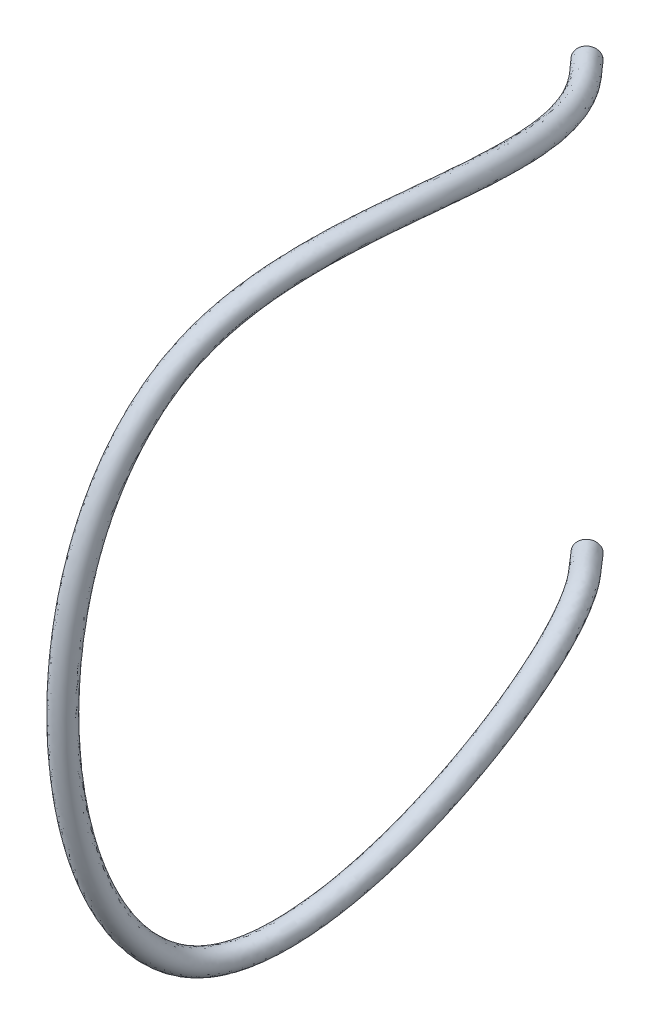
ISO-10303-21;
HEADER;
FILE_DESCRIPTION(('STEP AP214'),'2;1');
FILE_NAME('part.step','',(''),(''),'','','');
FILE_SCHEMA(('AUTOMOTIVE_DESIGN { 1 0 10303 214 1 1 1 1 }'));
ENDSEC;
DATA;
#1=APPLICATION_CONTEXT('core data for automotive mechanical design processes');
#2=APPLICATION_PROTOCOL_DEFINITION('international standard','automotive_design',2000,#1);
#3=PRODUCT_CONTEXT('',#1,'mechanical');
#4=PRODUCT('Part','Part','',(#3));
#5=PRODUCT_RELATED_PRODUCT_CATEGORY('part','',(#4));
#6=PRODUCT_DEFINITION_FORMATION('','',#4);
#7=PRODUCT_DEFINITION_CONTEXT('part definition',#1,'design');
#8=PRODUCT_DEFINITION('design','',#6,#7);
#9=PRODUCT_DEFINITION_SHAPE('','',#8);
#10=(LENGTH_UNIT() NAMED_UNIT(*) SI_UNIT(.MILLI.,.METRE.));
#11=(NAMED_UNIT(*) PLANE_ANGLE_UNIT() SI_UNIT($,.RADIAN.));
#12=(NAMED_UNIT(*) SI_UNIT($,.STERADIAN.) SOLID_ANGLE_UNIT());
#13=UNCERTAINTY_MEASURE_WITH_UNIT(LENGTH_MEASURE(1.E-05),#10,'distance_accuracy_value','');
#14=(GEOMETRIC_REPRESENTATION_CONTEXT(3) GLOBAL_UNCERTAINTY_ASSIGNED_CONTEXT((#13)) GLOBAL_UNIT_ASSIGNED_CONTEXT((#10,
#11,#12)) REPRESENTATION_CONTEXT('',''));
#15=CARTESIAN_POINT('',(0.,0.,0.));
#16=DIRECTION('',(0.,0.,1.));
#17=DIRECTION('',(1.,0.,0.));
#18=AXIS2_PLACEMENT_3D('',#15,#16,#17);
#19=CARTESIAN_POINT('',(45.5446581393842,91.0000000000004,-442.767858735174));
#20=DIRECTION('',(-0.655668098061901,0.,-0.755049233615855));
#21=DIRECTION('',(0.72822312542092,0.264188565464168,-0.632372897490219));
#22=AXIS2_PLACEMENT_3D('',#19,#20,#21);
#23=PLANE('',#22);
#24=CARTESIAN_POINT('',(45.5446581393842,91.0000000000004,-442.767858735174));
#25=DIRECTION('',(-0.655668098061901,0.,-0.755049233615855));
#26=DIRECTION('',(0.72822312542092,0.264188565464168,-0.632372897490219));
#27=AXIS2_PLACEMENT_3D('',#24,#25,#26);
#28=CIRCLE('',#27,3.99999999999983);
#29=CARTESIAN_POINT('',(48.4575506410677,92.056754261857,-445.297350325135));
#30=VERTEX_POINT('',#29);
#31=EDGE_CURVE('E44',#30,#30,#28,.T.);
#32=ORIENTED_EDGE('',*,*,#31,.T.);
#33=EDGE_LOOP('',(#32));
#34=FACE_BOUND('',#33,.T.);
#35=ADVANCED_FACE('F39',(#34),#23,.T.);
#36=CARTESIAN_POINT('',(45.5446581393831,-58.87,-442.767858735171));
#37=DIRECTION('',(0.655668098061896,0.,0.755049233615859));
#38=DIRECTION('',(0.755049233615859,0.,-0.655668098061896));
#39=AXIS2_PLACEMENT_3D('',#36,#37,#38);
#40=PLANE('',#39);
#41=CARTESIAN_POINT('',(45.5446581393831,-58.87,-442.767858735171));
#42=DIRECTION('',(0.655668098061896,0.,0.755049233615859));
#43=DIRECTION('',(0.755049233615859,0.,-0.655668098061896));
#44=AXIS2_PLACEMENT_3D('',#41,#42,#43);
#45=CIRCLE('',#44,3.99999999999983);
#46=CARTESIAN_POINT('',(48.5648550738464,-58.87,-445.390531127419));
#47=VERTEX_POINT('',#46);
#48=EDGE_CURVE('E10',#47,#47,#45,.T.);
#49=ORIENTED_EDGE('',*,*,#48,.F.);
#50=EDGE_LOOP('',(#49));
#51=FACE_BOUND('',#50,.T.);
#52=ADVANCED_FACE('F53',(#51),#40,.F.);
#53=CARTESIAN_POINT('',(48.4575506410677,92.056754261857,-445.297350325135));
#54=CARTESIAN_POINT('',(50.3875493327796,92.0567542611582,-443.074817256508));
#55=CARTESIAN_POINT('',(52.4843535071136,92.0146336075937,-440.883344708977));
#56=CARTESIAN_POINT('',(57.9286337386757,92.1335135214458,-433.984053774146));
#57=CARTESIAN_POINT('',(60.662065529613,92.4727452045095,-429.036904485743));
#58=CARTESIAN_POINT('',(64.8985399404625,93.4045020660071,-418.369218366216));
#59=CARTESIAN_POINT('',(66.4049769028892,93.9969651462761,-412.646351439814));
#60=CARTESIAN_POINT('',(69.4517712479349,95.7723134801796,-394.700857003907));
#61=CARTESIAN_POINT('',(69.5276188319668,96.9540892498482,-381.694649616329));
#62=CARTESIAN_POINT('',(67.4144691850316,97.365813609571,-355.530513215763));
#63=CARTESIAN_POINT('',(65.2181201506465,96.5982895178462,-342.371328793182));
#64=CARTESIAN_POINT('',(61.3527204895253,92.50618649552,-324.024565506061));
#65=CARTESIAN_POINT('',(59.9687246039237,90.6514054242433,-318.141502931796));
#66=CARTESIAN_POINT('',(57.1997749553748,85.7098328337427,-307.104612657496));
#67=CARTESIAN_POINT('',(55.8150378454201,82.6219738641295,-301.951126048831));
#68=CARTESIAN_POINT('',(52.6803536972611,73.319862536981,-290.638720980957));
#69=CARTESIAN_POINT('',(51.0375141143404,66.3456782031197,-285.027922923195));
#70=CARTESIAN_POINT('',(48.1616411575508,50.3167407571227,-275.774280105718));
#71=CARTESIAN_POINT('',(46.928004239872,41.2602080332135,-272.129272057686));
#72=CARTESIAN_POINT('',(43.8413708456977,12.254079473416,-263.934723714028));
#73=CARTESIAN_POINT('',(42.6012634473343,-9.53478137193692,-262.120917021619));
#74=CARTESIAN_POINT('',(42.0075900802884,-40.799833999419,-264.198095965556));
#75=CARTESIAN_POINT('',(42.021110921588,-50.9850829594817,-265.691348265239));
#76=CARTESIAN_POINT('',(42.4814607023931,-70.0355729871257,-270.18178477587));
#77=CARTESIAN_POINT('',(42.9281065501904,-78.9009725328332,-273.178271927403));
#78=CARTESIAN_POINT('',(44.2699670520108,-94.4676460201386,-280.596853703416));
#79=CARTESIAN_POINT('',(45.1649296611702,-101.172101911241,-285.018460752781));
#80=CARTESIAN_POINT('',(46.8650328614308,-108.949434208697,-292.696152146643));
#81=CARTESIAN_POINT('',(47.4915808572378,-111.161297197728,-295.430410871676));
#82=CARTESIAN_POINT('',(48.8674187241125,-114.697635770913,-301.240635637757));
#83=CARTESIAN_POINT('',(49.616870661272,-116.021353443503,-304.317113270531));
#84=CARTESIAN_POINT('',(51.6869009099639,-118.101852006725,-312.581142500386));
#85=CARTESIAN_POINT('',(53.0841216034667,-118.123881675152,-317.953626602086));
#86=CARTESIAN_POINT('',(55.9343511198018,-116.312470360117,-329.112378059233));
#87=CARTESIAN_POINT('',(57.3891621133871,-114.480016141973,-334.904156588299));
#88=CARTESIAN_POINT('',(60.1653959800684,-109.547518713588,-346.720544453926));
#89=CARTESIAN_POINT('',(61.4870476410806,-106.446304171464,-352.745635386815));
#90=CARTESIAN_POINT('',(63.802846230436,-99.5316907066481,-364.831481937249));
#91=CARTESIAN_POINT('',(64.7970078572049,-95.7180508784303,-370.891928591111));
#92=CARTESIAN_POINT('',(66.2590740894297,-87.9279057275569,-382.845163846748));
#93=CARTESIAN_POINT('',(66.7272112565878,-83.95136302129,-388.737495093919));
#94=CARTESIAN_POINT('',(66.931544132522,-76.3805768798056,-400.157625290089));
#95=CARTESIAN_POINT('',(66.6687735977012,-72.7859495569997,-405.684731262703));
#96=CARTESIAN_POINT('',(65.1829126609809,-66.5229844830243,-416.201014108797));
#97=CARTESIAN_POINT('',(63.9623891262764,-63.850627105027,-421.192244263323));
#98=CARTESIAN_POINT('',(61.1817141041614,-60.9803986460606,-428.165089405707));
#99=CARTESIAN_POINT('',(60.0950549097964,-60.2143315993119,-430.404111938756));
#100=CARTESIAN_POINT('',(58.1927008280221,-59.4225244172523,-433.606411249925));
#101=CARTESIAN_POINT('',(57.5132250774314,-59.2182920180249,-434.647577278852));
#102=CARTESIAN_POINT('',(56.4234737668278,-59.0110732474111,-436.163890277471));
#103=CARTESIAN_POINT('',(56.0484856621227,-58.9585211590038,-436.661735340507));
#104=CARTESIAN_POINT('',(55.4682838872667,-58.9056183737401,-437.3962078508));
#105=CARTESIAN_POINT('',(55.2719316367906,-58.8923025414618,-437.638981883464));
#106=CARTESIAN_POINT('',(54.9729758317268,-58.8789458687108,-437.999948287319));
#107=CARTESIAN_POINT('',(54.8725861009351,-58.8755962674657,-438.119737936936));
#108=CARTESIAN_POINT('',(54.7208957423748,-58.8722415662333,-438.298608485004));
#109=CARTESIAN_POINT('',(54.670148001828,-58.8714016111813,-438.35809634559));
#110=CARTESIAN_POINT('',(54.593750129554,-58.8705610238469,-438.44712274586));
#111=CARTESIAN_POINT('',(54.5682381289167,-58.8703507186101,-438.476763980829));
#112=CARTESIAN_POINT('',(54.5171220739904,-58.8700702067005,-438.535977668869));
#113=CARTESIAN_POINT('',(54.4957755552299,-58.8700002245554,-438.560646981962));
#114=CARTESIAN_POINT('',(54.4389637610691,-58.8699997979951,-438.626070403354));
#115=CARTESIAN_POINT('',(54.4043990722105,-58.87,-438.665873890527));
#116=CARTESIAN_POINT('',(54.342930188016,-58.87,-438.73665975618));
#117=CARTESIAN_POINT('',(54.3121957459184,-58.87,-438.772052689007));
#118=CARTESIAN_POINT('',(54.2199924196335,-58.87,-438.878231487478));
#119=CARTESIAN_POINT('',(54.1585235354397,-58.87,-438.94901735313));
#120=CARTESIAN_POINT('',(53.9741168828504,-58.87,-439.161374950096));
#121=CARTESIAN_POINT('',(53.8511791144711,-58.87,-439.302946681389));
#122=CARTESIAN_POINT('',(53.4823658093081,-58.87,-439.727661875304));
#123=CARTESIAN_POINT('',(53.2364902725237,-58.87,-440.010805337923));
#124=CARTESIAN_POINT('',(52.4988636622446,-58.87,-440.86023572569));
#125=CARTESIAN_POINT('',(52.0071125886781,-58.87,-441.426522650927));
#126=CARTESIAN_POINT('',(50.5318593680184,-58.87,-443.125383426588));
#127=CARTESIAN_POINT('',(49.5483572209476,-58.87,-444.257957277104));
#128=CARTESIAN_POINT('',(48.5648550738464,-58.87,-445.390531127419));
#129=CARTESIAN_POINT('',(50.053353632138,84.3409858801477,-446.683110439116));
#130=CARTESIAN_POINT('',(51.8965731979275,84.3409858795547,-444.560509809265));
#131=CARTESIAN_POINT('',(54.0419573478454,84.2965723875456,-442.325241065023));
#132=CARTESIAN_POINT('',(59.9483247043858,84.4255423111161,-434.840367892169));
#133=CARTESIAN_POINT('',(62.8566648628356,84.7912425015497,-429.54751702769));
#134=CARTESIAN_POINT('',(67.3043939358681,85.7694591260264,-418.347746641227));
#135=CARTESIAN_POINT('',(68.8515156268487,86.3822087295889,-412.433947063098));
#136=CARTESIAN_POINT('',(71.9597871503624,88.1934086835303,-394.125714541618));
#137=CARTESIAN_POINT('',(72.0045627663689,89.3637630414853,-381.141596749291));
#138=CARTESIAN_POINT('',(69.9287171782475,89.7681306756599,-355.441396762561));
#139=CARTESIAN_POINT('',(67.7906033993882,88.9936556258094,-342.730727182332));
#140=CARTESIAN_POINT('',(64.1547010029202,85.1445509653958,-325.473548251798));
#141=CARTESIAN_POINT('',(62.8712946426164,83.4170647297183,-320.025703625669));
#142=CARTESIAN_POINT('',(60.3512031041881,78.9196325458719,-309.980806503864));
#143=CARTESIAN_POINT('',(59.1145898943875,76.1529635218572,-305.386597954297));
#144=CARTESIAN_POINT('',(56.3559318996364,67.9594748990645,-295.419910601705));
#145=CARTESIAN_POINT('',(54.8753782813354,61.7069961852849,-290.349554491335));
#146=CARTESIAN_POINT('',(52.2356170331788,46.9670060739727,-281.83632042987));
#147=CARTESIAN_POINT('',(51.0792846873442,38.4880092403295,-278.403742093314));
#148=CARTESIAN_POINT('',(48.1680196059259,11.0218714248261,-270.636255833398));
#149=CARTESIAN_POINT('',(46.9769641432823,-9.98176529003919,-268.852407749844));
#150=CARTESIAN_POINT('',(46.4243450423732,-40.0329092034782,-270.836543195058));
#151=CARTESIAN_POINT('',(46.4443580281672,-49.8077701981056,-272.269313708493));
#152=CARTESIAN_POINT('',(46.8934901671901,-67.9453574106198,-276.53676742918));
#153=CARTESIAN_POINT('',(47.3235080394937,-76.3072767242854,-279.374860673606));
#154=CARTESIAN_POINT('',(48.5698256020079,-90.6757191582973,-286.216198096848));
#155=CARTESIAN_POINT('',(49.3873186313524,-96.6669932705931,-290.221718869497));
#156=CARTESIAN_POINT('',(50.8386675409232,-103.291031186188,-296.757225839999));
#157=CARTESIAN_POINT('',(51.3588300146365,-105.108533776335,-299.019684412695));
#158=CARTESIAN_POINT('',(52.4634578878713,-107.943786500414,-303.675480189467));
#159=CARTESIAN_POINT('',(53.0471474487205,-108.965160978832,-306.06636778242));
#160=CARTESIAN_POINT('',(54.6452864149984,-110.570447851132,-312.437601780084));
#161=CARTESIAN_POINT('',(55.7856361290972,-110.640989628635,-316.828753339225));
#162=CARTESIAN_POINT('',(58.2709445304307,-109.061560078254,-326.558591597303));
#163=CARTESIAN_POINT('',(59.6061629024326,-107.407826888002,-331.867110037724));
#164=CARTESIAN_POINT('',(62.2158029591786,-102.771396801369,-342.974265213663));
#165=CARTESIAN_POINT('',(63.4895991770864,-99.7958009254765,-348.771430662397));
#166=CARTESIAN_POINT('',(65.7451654185991,-93.0610707155338,-360.542871162918));
#167=CARTESIAN_POINT('',(66.7275703676531,-89.3036648272426,-366.518160070062));
#168=CARTESIAN_POINT('',(68.1824679737659,-81.5522761661542,-378.411973713598));
#169=CARTESIAN_POINT('',(68.6559935413054,-77.5586841034962,-384.32998710868));
#170=CARTESIAN_POINT('',(68.8636975082959,-69.8635174585494,-395.93774480356));
#171=CARTESIAN_POINT('',(68.6017509028961,-66.1607826882152,-401.625208363841));
#172=CARTESIAN_POINT('',(67.0363325610827,-59.5624717057759,-412.704578778614));
#173=CARTESIAN_POINT('',(65.7431442667309,-56.6526649871667,-418.102695328134));
#174=CARTESIAN_POINT('',(62.5857347213837,-53.3935237454136,-426.020370221185));
#175=CARTESIAN_POINT('',(61.3250547645748,-52.4945431253711,-428.631603615636));
#176=CARTESIAN_POINT('',(59.0481824317373,-51.5468393264344,-432.464399672521));
#177=CARTESIAN_POINT('',(58.224977068629,-51.298323231252,-433.727205718906));
#178=CARTESIAN_POINT('',(56.8897905627322,-51.0444315727458,-435.585043023102));
#179=CARTESIAN_POINT('',(56.4280606594048,-50.9796184324113,-436.198186242619));
#180=CARTESIAN_POINT('',(55.710660748255,-50.9142044588131,-437.10634924194));
#181=CARTESIAN_POINT('',(55.4673960476229,-50.8976968992244,-437.407139094859));
#182=CARTESIAN_POINT('',(55.0963841530302,-50.8811203917232,-437.855113129646));
#183=CARTESIAN_POINT('',(54.9716944982873,-50.8769586595986,-438.003902333036));
#184=CARTESIAN_POINT('',(54.7831434436136,-50.8727885106385,-438.226241221985));
#185=CARTESIAN_POINT('',(54.7200403525536,-50.8717438536747,-438.300213359035));
#186=CARTESIAN_POINT('',(54.6250083045955,-50.8706981621509,-438.410955060254));
#187=CARTESIAN_POINT('',(54.5932680547579,-50.870436479561,-438.447832876339));
#188=CARTESIAN_POINT('',(54.5296620538373,-50.8700873985057,-438.52151545868));
#189=CARTESIAN_POINT('',(54.4989146436962,-50.8700002795423,-438.557032025752));
#190=CARTESIAN_POINT('',(54.4361399085168,-50.8699997485309,-438.6293223357));
#191=CARTESIAN_POINT('',(54.4043990722105,-50.8700000000004,-438.665873890527));
#192=CARTESIAN_POINT('',(54.342930188016,-50.8700000000004,-438.73665975618));
#193=CARTESIAN_POINT('',(54.3121957459184,-50.8700000000004,-438.772052689007));
#194=CARTESIAN_POINT('',(54.2199924196335,-50.8700000000004,-438.878231487478));
#195=CARTESIAN_POINT('',(54.1585235354397,-50.8700000000004,-438.94901735313));
#196=CARTESIAN_POINT('',(53.9741168828504,-50.8700000000004,-439.161374950096));
#197=CARTESIAN_POINT('',(53.8511791144711,-50.8700000000004,-439.302946681389));
#198=CARTESIAN_POINT('',(53.4823658093081,-50.8700000000004,-439.727661875304));
#199=CARTESIAN_POINT('',(53.2364902725237,-50.8700000000004,-440.010805337923));
#200=CARTESIAN_POINT('',(52.4988636622446,-50.8700000000004,-440.86023572569));
#201=CARTESIAN_POINT('',(52.0071125886781,-50.8700000000004,-441.426522650927));
#202=CARTESIAN_POINT('',(50.5318593680184,-50.8700000000004,-443.125383426588));
#203=CARTESIAN_POINT('',(49.5483572209476,-50.8700000000004,-444.257957277104));
#204=CARTESIAN_POINT('',(48.5648550738464,-50.8700000000004,-445.390531127419));
#205=CARTESIAN_POINT('',(44.227568628771,82.2274773564345,-441.624127259194));
#206=CARTESIAN_POINT('',(46.2130727406426,82.227477355545,-439.337675684979));
#207=CARTESIAN_POINT('',(48.2788051640402,82.1868232524036,-437.174214914419));
#208=CARTESIAN_POINT('',(53.4275242291864,82.29924939121,-430.649475257715));
#209=CARTESIAN_POINT('',(56.0048901765677,82.6194077333229,-425.983449105913));
#210=CARTESIAN_POINT('',(60.0073246413225,83.4997366829426,-415.904919895606));
#211=CARTESIAN_POINT('',(61.4333372488885,84.0602646564786,-410.490196972968));
#212=CARTESIAN_POINT('',(64.3186477952585,85.7416683819375,-393.495004289703));
#213=CARTESIAN_POINT('',(64.3859242984696,86.8594539590833,-381.154031994142));
#214=CARTESIAN_POINT('',(62.4004318221322,87.2463690845169,-356.573213349258));
#215=CARTESIAN_POINT('',(60.3448738740827,86.5019556708788,-344.341290440678));
#216=CARTESIAN_POINT('',(56.8573836332133,82.8100495781098,-327.788630363365));
#217=CARTESIAN_POINT('',(55.6283110193816,81.1548683834397,-322.572312568138));
#218=CARTESIAN_POINT('',(53.2207581111487,76.8582995121029,-312.976006247438));
#219=CARTESIAN_POINT('',(52.0419164779928,74.222323660702,-308.598179480729));
#220=CARTESIAN_POINT('',(49.4137471497373,66.4096925952851,-299.099080411977));
#221=CARTESIAN_POINT('',(47.9897138574337,60.405221056403,-294.217472056841));
#222=CARTESIAN_POINT('',(45.432822870511,46.1078355277413,-285.96567835749));
#223=CARTESIAN_POINT('',(44.3040475477634,37.8269953212767,-282.610119206477));
#224=CARTESIAN_POINT('',(41.4567174105711,10.8893488358303,-275.004139194911));
#225=CARTESIAN_POINT('',(40.286080309059,-9.8444624954541,-273.244711267857));
#226=CARTESIAN_POINT('',(39.753372680524,-39.4742976527622,-275.218992061281));
#227=CARTESIAN_POINT('',(39.7775754636212,-49.1060849005426,-276.638307901745));
#228=CARTESIAN_POINT('',(40.2263278356293,-66.9246699753203,-280.841834895649));
#229=CARTESIAN_POINT('',(40.6521423259924,-75.1103439459194,-283.630850205874));
#230=CARTESIAN_POINT('',(41.8678760464466,-89.0598220358616,-290.281412002989));
#231=CARTESIAN_POINT('',(42.6594927075322,-94.8020132508666,-294.146210236375));
#232=CARTESIAN_POINT('',(44.0257566678155,-101.023695419047,-300.289829711172));
#233=CARTESIAN_POINT('',(44.5093716635177,-102.703669236097,-302.389895590298));
#234=CARTESIAN_POINT('',(45.5205748521056,-105.294262589523,-306.647545925772));
#235=CARTESIAN_POINT('',(46.0470630740323,-106.210022296827,-308.801657587338));
#236=CARTESIAN_POINT('',(47.4822043999548,-107.64842469365,-314.51868442761));
#237=CARTESIAN_POINT('',(48.5253415833894,-107.731642095661,-318.538102317203));
#238=CARTESIAN_POINT('',(50.8575621073082,-106.24946009326,-327.668505379964));
#239=CARTESIAN_POINT('',(52.1333007916897,-104.678325292739,-332.738299945668));
#240=CARTESIAN_POINT('',(54.6455555446476,-100.214902621298,-343.430894748917));
#241=CARTESIAN_POINT('',(55.8809885710638,-97.3320584324715,-349.051260505396));
#242=CARTESIAN_POINT('',(58.0715201154386,-90.7915106662408,-360.48327158415));
#243=CARTESIAN_POINT('',(59.027224160692,-87.1360173431107,-366.296548687869));
#244=CARTESIAN_POINT('',(60.4398006123346,-79.6101727673421,-377.844104502895));
#245=CARTESIAN_POINT('',(60.8972408045336,-75.7402869890608,-383.578786580064));
#246=CARTESIAN_POINT('',(61.0971079320973,-68.3355999939401,-394.748346248612));
#247=CARTESIAN_POINT('',(60.8413423526279,-64.8004063609492,-400.182329053537));
#248=CARTESIAN_POINT('',(59.3712611794868,-58.6039417913108,-410.586946508585));
#249=CARTESIAN_POINT('',(58.1620952953523,-55.9364795975823,-415.559684292232));
#250=CARTESIAN_POINT('',(55.3536636345956,-53.0375056304982,-422.60226673656));
#251=CARTESIAN_POINT('',(54.2493721521649,-52.256106838539,-424.881483596695));
#252=CARTESIAN_POINT('',(52.2952809792431,-51.4427252132387,-428.170931804336));
#253=CARTESIAN_POINT('',(51.5942960945631,-51.2316658863954,-429.245524046299));
#254=CARTESIAN_POINT('',(50.4647172254226,-51.0168612491713,-430.817272738589));
#255=CARTESIAN_POINT('',(50.0751987950671,-50.9622290325705,-431.334464961588));
#256=CARTESIAN_POINT('',(49.4712725391142,-50.9071545655287,-432.098982637243));
#257=CARTESIAN_POINT('',(49.266688576393,-50.8932764514937,-432.351939490958));
#258=CARTESIAN_POINT('',(48.9549090526893,-50.8793432192835,-432.728394943196));
#259=CARTESIAN_POINT('',(48.8501651807412,-50.8758462091578,-432.85338319338));
#260=CARTESIAN_POINT('',(48.6918243141139,-50.8723425008538,-433.040098771047));
#261=CARTESIAN_POINT('',(48.6388398593537,-50.8714648931406,-433.102209492896));
#262=CARTESIAN_POINT('',(48.5590571470206,-50.8705864553099,-433.195181151368));
#263=CARTESIAN_POINT('',(48.5324119051983,-50.8703666378811,-433.226139299937));
#264=CARTESIAN_POINT('',(48.4790194571964,-50.8700734102429,-433.287990332743));
#265=CARTESIAN_POINT('',(48.4559557205974,-50.8700002348019,-433.31464114264));
#266=CARTESIAN_POINT('',(48.398053503954,-50.8699997887783,-433.381320288739));
#267=CARTESIAN_POINT('',(48.3640052032839,-50.8700000000004,-433.420529106033));
#268=CARTESIAN_POINT('',(48.3025363190894,-50.8700000000004,-433.491314971685));
#269=CARTESIAN_POINT('',(48.2718018769918,-50.8700000000004,-433.526707904512));
#270=CARTESIAN_POINT('',(48.1795985507069,-50.8700000000004,-433.632886702983));
#271=CARTESIAN_POINT('',(48.1181296665131,-50.8700000000004,-433.703672568635));
#272=CARTESIAN_POINT('',(47.9337230139238,-50.8700000000004,-433.916030165601));
#273=CARTESIAN_POINT('',(47.8107852455445,-50.8700000000004,-434.057601896895));
#274=CARTESIAN_POINT('',(47.4419719403815,-50.8700000000004,-434.48231709081));
#275=CARTESIAN_POINT('',(47.1960964035971,-50.8700000000004,-434.765460553428));
#276=CARTESIAN_POINT('',(46.458469793318,-50.8700000000004,-435.614890941196));
#277=CARTESIAN_POINT('',(45.9667187197515,-50.8700000000004,-436.181177866433));
#278=CARTESIAN_POINT('',(44.4914654990918,-50.8700000000004,-437.880038642093));
#279=CARTESIAN_POINT('',(43.507963352021,-50.8700000000004,-439.012612492609));
#280=CARTESIAN_POINT('',(42.5244612049198,-50.8700000000004,-440.145186342924));
#281=CARTESIAN_POINT('',(42.6317656377007,89.9432457381438,-440.238367145213));
#282=CARTESIAN_POINT('',(44.7040488754946,89.9432457370637,-437.851983132095));
#283=CARTESIAN_POINT('',(46.721201323267,89.9048844724517,-435.732318558414));
#284=CARTESIAN_POINT('',(51.4078332635485,90.0072206015396,-429.79316113962));
#285=CARTESIAN_POINT('',(53.8102908433451,90.3009104362826,-425.472836564117));
#286=CARTESIAN_POINT('',(57.6014706459169,91.1347796229233,-415.926391620443));
#287=CARTESIAN_POINT('',(58.9867985247659,91.6750210732066,-410.702601349685));
#288=CARTESIAN_POINT('',(61.810631893157,93.3205731785054,-394.070146751993));
#289=CARTESIAN_POINT('',(61.9089803640675,94.4497801673571,-381.707084861181));
#290=CARTESIAN_POINT('',(59.8861838289162,94.8440520185171,-356.66232980246));
#291=CARTESIAN_POINT('',(57.772390625341,94.1065895629156,-343.981892051353));
#292=CARTESIAN_POINT('',(54.0554031198183,90.171685108234,-326.339647617716));
#293=CARTESIAN_POINT('',(52.7257409806889,88.389209078049,-320.688111874181));
#294=CARTESIAN_POINT('',(50.0693299623354,83.6484997998893,-310.099812401155));
#295=CARTESIAN_POINT('',(48.7423644290253,80.6913340029743,-305.162707575263));
#296=CARTESIAN_POINT('',(45.738168947362,71.7700802332016,-294.317890791229));
#297=CARTESIAN_POINT('',(44.1518496904387,65.0439030741738,-288.895840488701));
#298=CARTESIAN_POINT('',(41.3588469948829,49.4575702109555,-279.903638033338));
#299=CARTESIAN_POINT('',(40.1527671002912,40.5991941140912,-276.335649170849));
#300=CARTESIAN_POINT('',(37.1300686503428,12.1215568845591,-268.302607075541));
#301=CARTESIAN_POINT('',(35.9103796132549,-9.39747857735177,-266.513220539632));
#302=CARTESIAN_POINT('',(35.3366177183671,-40.241222448703,-268.580544831779));
#303=CARTESIAN_POINT('',(35.3543283571093,-50.2833976617839,-270.060342458492));
#304=CARTESIAN_POINT('',(35.8142983707649,-69.0148855519608,-274.486852242339));
#305=CARTESIAN_POINT('',(36.256740836689,-77.7040397544672,-277.43426145967));
#306=CARTESIAN_POINT('',(37.5680174964493,-92.8517488977028,-284.662067609558));
#307=CARTESIAN_POINT('',(38.4371037373499,-99.3071218915147,-288.942952119659));
#308=CARTESIAN_POINT('',(40.052121988323,-106.682098441556,-296.228756017816));
#309=CARTESIAN_POINT('',(40.6421225061189,-108.75643265749,-298.800622049372));
#310=CARTESIAN_POINT('',(41.9245356883467,-112.048111860021,-304.21270137397));
#311=CARTESIAN_POINT('',(42.6167862865837,-113.266214761476,-307.052403075449));
#312=CARTESIAN_POINT('',(44.5238188949204,-115.179828849278,-314.662225147913));
#313=CARTESIAN_POINT('',(45.8238270578375,-115.214534142139,-319.662975580143));
#314=CARTESIAN_POINT('',(48.5209686966005,-113.500370375163,-330.222291841815));
#315=CARTESIAN_POINT('',(49.9163000025548,-111.75051454671,-335.775346496244));
#316=CARTESIAN_POINT('',(52.5951485656267,-106.991024533516,-347.17717398918));
#317=CARTESIAN_POINT('',(53.8784370349614,-103.982561678459,-353.025465229814));
#318=CARTESIAN_POINT('',(56.129200927372,-97.2621306573551,-364.771882358481));
#319=CARTESIAN_POINT('',(57.0966616503418,-93.5504033942984,-370.670317208917));
#320=CARTESIAN_POINT('',(58.5164067279003,-85.9858023287449,-382.277294636045));
#321=CARTESIAN_POINT('',(58.9684585196295,-82.1329659068314,-387.986294565303));
#322=CARTESIAN_POINT('',(59.1649545565098,-74.8526594152196,-398.96822673514));
#323=CARTESIAN_POINT('',(58.9083650474329,-71.4255732297545,-404.241851952399));
#324=CARTESIAN_POINT('',(57.517841279385,-65.5644545685385,-414.083381838768));
#325=CARTESIAN_POINT('',(56.3813401549326,-63.1344417154513,-418.649233227421));
#326=CARTESIAN_POINT('',(53.9496430173559,-60.6243805311408,-424.746985921082));
#327=CARTESIAN_POINT('',(53.0193722973864,-59.9758953124717,-426.653991919814));
#328=CARTESIAN_POINT('',(51.4397993755278,-59.3184103040607,-429.31294338174));
#329=CARTESIAN_POINT('',(50.8825441033656,-59.1516346731663,-430.165895606245));
#330=CARTESIAN_POINT('',(49.9984004295181,-58.9835029238376,-431.396119992958));
#331=CARTESIAN_POINT('',(49.695623797783,-58.9411317591619,-431.798014059476));
#332=CARTESIAN_POINT('',(49.2288956781269,-58.8985684804561,-432.388841246103));
#333=CARTESIAN_POINT('',(49.0712241655617,-58.8878820937301,-432.583782279559));
#334=CARTESIAN_POINT('',(48.8315007313855,-58.8771686962716,-432.873230100872));
#335=CARTESIAN_POINT('',(48.751056783389,-58.8744838170254,-432.969218797281));
#336=CARTESIAN_POINT('',(48.6295766128751,-58.8717955564483,-433.112466034066));
#337=CARTESIAN_POINT('',(48.5889475086281,-58.8711226506472,-433.160092479451));
#338=CARTESIAN_POINT('',(48.5277989719791,-58.8704493170059,-433.231348836974));
#339=CARTESIAN_POINT('',(48.5073819793571,-58.8702808769299,-433.255070404427));
#340=CARTESIAN_POINT('',(48.4664794773495,-58.8700562184379,-433.302452542931));
#341=CARTESIAN_POINT('',(48.4528166321312,-58.8700001798151,-433.31825609885));
#342=CARTESIAN_POINT('',(48.4008773565062,-58.8699998382426,-433.378068356393));
#343=CARTESIAN_POINT('',(48.3640052032839,-58.87,-433.420529106032));
#344=CARTESIAN_POINT('',(48.3025363190894,-58.87,-433.491314971685));
#345=CARTESIAN_POINT('',(48.2718018769918,-58.87,-433.526707904512));
#346=CARTESIAN_POINT('',(48.1795985507069,-58.87,-433.632886702983));
#347=CARTESIAN_POINT('',(48.1181296665131,-58.87,-433.703672568635));
#348=CARTESIAN_POINT('',(47.9337230139238,-58.87,-433.916030165601));
#349=CARTESIAN_POINT('',(47.8107852455445,-58.87,-434.057601896894));
#350=CARTESIAN_POINT('',(47.4419719403815,-58.87,-434.48231709081));
#351=CARTESIAN_POINT('',(47.1960964035971,-58.87,-434.765460553428));
#352=CARTESIAN_POINT('',(46.458469793318,-58.87,-435.614890941196));
#353=CARTESIAN_POINT('',(45.9667187197515,-58.87,-436.181177866433));
#354=CARTESIAN_POINT('',(44.4914654990918,-58.87,-437.880038642093));
#355=CARTESIAN_POINT('',(43.507963352021,-58.87,-439.012612492609));
#356=CARTESIAN_POINT('',(42.5244612049198,-58.87,-440.145186342924));
#357=CARTESIAN_POINT('',(41.0359626466305,97.6590141198532,-438.852607031233));
#358=CARTESIAN_POINT('',(43.1950250103468,97.6590141185825,-436.366290579211));
#359=CARTESIAN_POINT('',(45.163597482494,97.6229456924998,-434.29042220241));
#360=CARTESIAN_POINT('',(49.3881422979108,97.7151918118694,-428.936847021525));
#361=CARTESIAN_POINT('',(51.6156915101225,97.9824131392423,-424.962224022321));
#362=CARTESIAN_POINT('',(55.1956166505113,98.769822562904,-415.947863345281));
#363=CARTESIAN_POINT('',(56.5402598006434,99.2897774899346,-410.915005726401));
#364=CARTESIAN_POINT('',(59.3026159910555,100.899477975073,-394.645289214282));
#365=CARTESIAN_POINT('',(59.4320364296654,102.040106375631,-382.260137728218));
#366=CARTESIAN_POINT('',(57.3719358357002,102.441734952517,-356.751446255663));
#367=CARTESIAN_POINT('',(55.1999073765994,101.711223454952,-343.622493662028));
#368=CARTESIAN_POINT('',(51.2534226064234,97.5333206383583,-324.890664872066));
#369=CARTESIAN_POINT('',(49.8231709419963,95.6235497726583,-318.803911180223));
#370=CARTESIAN_POINT('',(46.917901813522,90.4387000876758,-307.223618554871));
#371=CARTESIAN_POINT('',(45.4428123800579,87.1603443452466,-301.727235669797));
#372=CARTESIAN_POINT('',(42.0625907449866,77.1304678711181,-289.53670117048));
#373=CARTESIAN_POINT('',(40.3139855234437,69.6825850919445,-283.574208920561));
#374=CARTESIAN_POINT('',(37.2848711192549,52.8073048941696,-273.841597709187));
#375=CARTESIAN_POINT('',(36.001486652819,43.3713929069058,-270.061179135222));
#376=CARTESIAN_POINT('',(32.8034198901146,13.3537649332879,-261.601074956171));
#377=CARTESIAN_POINT('',(31.5346789174509,-8.95049465924956,-259.781729811407));
#378=CARTESIAN_POINT('',(30.9198627562102,-41.0081472446439,-261.942097602278));
#379=CARTESIAN_POINT('',(30.9310812505975,-51.4607104230254,-263.482377015238));
#380=CARTESIAN_POINT('',(31.4022689059005,-71.1051011286015,-268.131869589029));
#381=CARTESIAN_POINT('',(31.8613393473857,-80.2977355630151,-271.237672713466));
#382=CARTESIAN_POINT('',(33.2681589464522,-96.6436757595442,-279.042723216126));
#383=CARTESIAN_POINT('',(34.2147147671678,-103.812230532163,-283.739694002942));
#384=CARTESIAN_POINT('',(36.0784873088307,-112.340501464065,-292.167682324461));
#385=CARTESIAN_POINT('',(36.7748733487202,-114.809196078882,-295.211348508446));
#386=CARTESIAN_POINT('',(38.328496524588,-118.801961130519,-301.777856822167));
#387=CARTESIAN_POINT('',(39.1865094991352,-120.322407226125,-305.303148563559));
#388=CARTESIAN_POINT('',(41.5654333898859,-122.711233004906,-314.805765868216));
#389=CARTESIAN_POINT('',(43.1223125322857,-122.697426188616,-320.787848843083));
#390=CARTESIAN_POINT('',(46.1843752858928,-120.751280657065,-332.776078303666));
#391=CARTESIAN_POINT('',(47.69929921342,-118.822703800681,-338.812393046819));
#392=CARTESIAN_POINT('',(50.5447415866059,-113.767146445735,-350.923453229444));
#393=CARTESIAN_POINT('',(51.8758854988591,-110.633064924446,-356.999669954232));
#394=CARTESIAN_POINT('',(54.1868817393054,-103.732750648469,-369.060493132812));
#395=CARTESIAN_POINT('',(55.1660991399917,-99.9647894454862,-375.044085729966));
#396=CARTESIAN_POINT('',(56.5930128434662,-92.3614318901477,-386.710484769195));
#397=CARTESIAN_POINT('',(57.0396762347254,-88.5256448246019,-392.393802550541));
#398=CARTESIAN_POINT('',(57.2328011809225,-81.3697188364991,-403.188107221669));
#399=CARTESIAN_POINT('',(56.975387742238,-78.0507400985597,-408.30137485126));
#400=CARTESIAN_POINT('',(55.6644213792832,-72.5249673457661,-417.579817168951));
#401=CARTESIAN_POINT('',(54.600585014513,-70.3324038333204,-421.73878216261));
#402=CARTESIAN_POINT('',(52.5456224001162,-68.2112554317834,-426.891705105604));
#403=CARTESIAN_POINT('',(51.789372442608,-67.6956837864045,-428.426500242934));
#404=CARTESIAN_POINT('',(50.5843177718126,-67.1940953948827,-430.454954959144));
#405=CARTESIAN_POINT('',(50.1707921121681,-67.0716034599372,-431.086267166191));
#406=CARTESIAN_POINT('',(49.5320836336137,-66.950144598504,-431.974967247328));
#407=CARTESIAN_POINT('',(49.3160488004989,-66.9200344857534,-432.261563157364));
#408=CARTESIAN_POINT('',(48.9865188171396,-66.8899823953835,-432.678699854963));
#409=CARTESIAN_POINT('',(48.8757597547304,-66.8824877359666,-432.81562506816));
#410=CARTESIAN_POINT('',(48.7080924100816,-66.8749941732597,-433.018065258547));
#411=CARTESIAN_POINT('',(48.6519483860369,-66.873121424893,-433.085054401181));
#412=CARTESIAN_POINT('',(48.5673289116363,-66.8712486120428,-433.184833297086));
#413=CARTESIAN_POINT('',(48.5390551579025,-66.8707804081539,-433.217975466006));
#414=CARTESIAN_POINT('',(48.4965407969376,-66.8703121787019,-433.26751652258));
#415=CARTESIAN_POINT('',(48.4823520535159,-66.8701951159789,-433.284001508918));
#416=CARTESIAN_POINT('',(48.4539394975027,-66.870039026633,-433.31691475312));
#417=CARTESIAN_POINT('',(48.4496775436649,-66.8700001248282,-433.32187105506));
#418=CARTESIAN_POINT('',(48.4037012090585,-66.8699998877068,-433.374816424047));
#419=CARTESIAN_POINT('',(48.3640052032839,-66.8699999999997,-433.420529106033));
#420=CARTESIAN_POINT('',(48.3025363190894,-66.8699999999997,-433.491314971685));
#421=CARTESIAN_POINT('',(48.2718018769918,-66.8699999999997,-433.526707904512));
#422=CARTESIAN_POINT('',(48.1795985507069,-66.8699999999997,-433.632886702983));
#423=CARTESIAN_POINT('',(48.1181296665131,-66.8699999999997,-433.703672568635));
#424=CARTESIAN_POINT('',(47.9337230139238,-66.8699999999997,-433.916030165601));
#425=CARTESIAN_POINT('',(47.8107852455445,-66.8699999999997,-434.057601896895));
#426=CARTESIAN_POINT('',(47.4419719403815,-66.8699999999997,-434.48231709081));
#427=CARTESIAN_POINT('',(47.1960964035971,-66.8699999999997,-434.765460553428));
#428=CARTESIAN_POINT('',(46.458469793318,-66.8699999999997,-435.614890941196));
#429=CARTESIAN_POINT('',(45.9667187197515,-66.8699999999997,-436.181177866433));
#430=CARTESIAN_POINT('',(44.4914654990918,-66.8699999999997,-437.880038642093));
#431=CARTESIAN_POINT('',(43.507963352021,-66.8699999999997,-439.012612492609));
#432=CARTESIAN_POINT('',(42.5244612049198,-66.8699999999997,-440.145186342924));
#433=CARTESIAN_POINT('',(46.8617476499975,99.7725226435664,-443.911590211154));
#434=CARTESIAN_POINT('',(48.8785254676317,99.7725226427616,-441.589124703751));
#435=CARTESIAN_POINT('',(50.9267496663818,99.7326948276418,-439.441448352931));
#436=CARTESIAN_POINT('',(55.9089427729658,99.8414847317754,-433.127739656124));
#437=CARTESIAN_POINT('',(58.4674661963905,100.154247907469,-428.526291943796));
#438=CARTESIAN_POINT('',(62.4926859450569,101.039545005988,-418.390690091204));
#439=CARTESIAN_POINT('',(63.9584381789297,101.611721562963,-412.858755816531));
#440=CARTESIAN_POINT('',(66.9437553455075,103.351218276829,-395.275999466197));
#441=CARTESIAN_POINT('',(67.0506748975647,104.544415458211,-382.247702483367));
#442=CARTESIAN_POINT('',(64.9002211918156,104.963496543482,-355.619629668966));
#443=CARTESIAN_POINT('',(62.6456369019049,104.202923409883,-342.011930404031));
#444=CARTESIAN_POINT('',(58.5507399761303,99.8678220256442,-322.575582760325));
#445=CARTESIAN_POINT('',(57.0661545652311,97.8857461187682,-316.257302237922));
#446=CARTESIAN_POINT('',(54.0483468065614,92.5000331216135,-304.228418811129));
#447=CARTESIAN_POINT('',(52.5154857964527,89.0909842064018,-298.515654143365));
#448=CARTESIAN_POINT('',(49.0047754948857,78.6802501748976,-285.857531360208));
#449=CARTESIAN_POINT('',(47.1996499473454,70.9843602209545,-279.706291355055));
#450=CARTESIAN_POINT('',(44.0876652819227,53.6664754402728,-269.712239781567));
#451=CARTESIAN_POINT('',(42.7767237923998,44.0324068260974,-265.854802022059));
#452=CARTESIAN_POINT('',(39.5147220854694,13.4862875220059,-257.233191594657));
#453=CARTESIAN_POINT('',(38.2255627513862,-9.0877974538346,-255.389426293394));
#454=CARTESIAN_POINT('',(37.5908351182035,-41.5667587953598,-257.559648736055));
#455=CARTESIAN_POINT('',(37.5978638150088,-52.1623957208578,-259.113382821985));
#456=CARTESIAN_POINT('',(38.069431237596,-72.1257885636315,-263.82680212256));
#457=CARTESIAN_POINT('',(38.532705060887,-81.4946683413811,-266.981683181199));
#458=CARTESIAN_POINT('',(39.9701085020136,-98.2595728819798,-274.977509309984));
#459=CARTESIAN_POINT('',(40.9425406909879,-105.67721055189,-279.815202636064));
#460=CARTESIAN_POINT('',(42.8913981819384,-114.607837231206,-288.635078453288));
#461=CARTESIAN_POINT('',(43.624331699839,-117.21406061912,-291.841137330657));
#462=CARTESIAN_POINT('',(45.2713795603537,-121.451485041411,-298.805791086048));
#463=CARTESIAN_POINT('',(46.1865938738235,-123.077545908175,-302.567858758642));
#464=CARTESIAN_POINT('',(48.7285154049295,-125.633256162317,-312.724683220689));
#465=CARTESIAN_POINT('',(50.3826070778361,-125.60677372167,-319.078499864947));
#466=CARTESIAN_POINT('',(53.5977577091728,-123.56338064198,-331.666164521162));
#467=CARTESIAN_POINT('',(55.1721613243416,-121.552205395944,-337.941203138875));
#468=CARTESIAN_POINT('',(58.1149890009582,-116.323640625806,-350.46682369419));
#469=CARTESIAN_POINT('',(59.4844961050748,-113.096807417451,-356.719840111233));
#470=CARTESIAN_POINT('',(61.8605270422728,-106.002310697762,-369.12009271158));
#471=CARTESIAN_POINT('',(62.8664453467567,-102.132436929618,-375.265697112159));
#472=CARTESIAN_POINT('',(64.3356802050936,-94.3035352889597,-387.278353979898));
#473=CARTESIAN_POINT('',(64.7984289718702,-90.3440419390839,-393.145003079158));
#474=CARTESIAN_POINT('',(64.9993907567481,-82.8976363010617,-404.377505776618));
#475=CARTESIAN_POINT('',(64.7357962925063,-79.4111164257842,-409.744254161565));
#476=CARTESIAN_POINT('',(63.3294927608791,-73.4834972602727,-419.69744943898));
#477=CARTESIAN_POINT('',(62.1816339858218,-71.0485892228873,-424.281793198513));
#478=CARTESIAN_POINT('',(59.7776934869391,-68.5672735467075,-430.309808590229));
#479=CARTESIAN_POINT('',(58.8650550550179,-67.9341200732528,-432.176620261875));
#480=CARTESIAN_POINT('',(57.3372192243069,-67.2982095080703,-434.748422827329));
#481=CARTESIAN_POINT('',(56.8014730862339,-67.1382608047977,-435.567948838798));
#482=CARTESIAN_POINT('',(55.9571569709233,-66.9777149220765,-436.74273753184));
#483=CARTESIAN_POINT('',(55.6689106648405,-66.9374238855962,-437.125284438396));
#484=CARTESIAN_POINT('',(55.2259070262784,-66.897032288667,-437.68606645966));
#485=CARTESIAN_POINT('',(55.0764672259583,-66.8869081836992,-437.870824672069));
#486=CARTESIAN_POINT('',(54.8495675104235,-66.8767713456984,-438.144783444993));
#487=CARTESIAN_POINT('',(54.7734777035829,-66.8742338753328,-438.235573540836));
#488=CARTESIAN_POINT('',(54.658648041136,-66.8716946218281,-438.370975748024));
#489=CARTESIAN_POINT('',(54.6202556511024,-66.871059368688,-438.415979332145));
#490=CARTESIAN_POINT('',(54.5624919545125,-66.8704238855429,-438.483290431466));
#491=CARTESIAN_POINT('',(54.5432082030755,-66.8702649576592,-438.505695085319));
#492=CARTESIAN_POINT('',(54.5045820941435,-66.8700530148954,-438.550439879057));
#493=CARTESIAN_POINT('',(54.4926364667637,-66.8700001695686,-438.564261938172));
#494=CARTESIAN_POINT('',(54.4417876136213,-66.8699998474594,-438.622818471008));
#495=CARTESIAN_POINT('',(54.4043990722105,-66.8699999999997,-438.665873890527));
#496=CARTESIAN_POINT('',(54.342930188016,-66.8699999999997,-438.73665975618));
#497=CARTESIAN_POINT('',(54.3121957459184,-66.8699999999997,-438.772052689007));
#498=CARTESIAN_POINT('',(54.2199924196335,-66.8699999999997,-438.878231487478));
#499=CARTESIAN_POINT('',(54.1585235354397,-66.8699999999997,-438.94901735313));
#500=CARTESIAN_POINT('',(53.9741168828504,-66.8699999999997,-439.161374950096));
#501=CARTESIAN_POINT('',(53.8511791144711,-66.8699999999997,-439.302946681389));
#502=CARTESIAN_POINT('',(53.4823658093081,-66.8699999999997,-439.727661875304));
#503=CARTESIAN_POINT('',(53.2364902725237,-66.8699999999997,-440.010805337923));
#504=CARTESIAN_POINT('',(52.4988636622446,-66.8699999999997,-440.86023572569));
#505=CARTESIAN_POINT('',(52.0071125886781,-66.8699999999997,-441.426522650927));
#506=CARTESIAN_POINT('',(50.5318593680184,-66.8699999999997,-443.125383426588));
#507=CARTESIAN_POINT('',(49.5483572209476,-66.8699999999997,-444.257957277104));
#508=CARTESIAN_POINT('',(48.5648550738464,-66.8699999999997,-445.390531127419));
#509=CARTESIAN_POINT('',(48.4575506410677,92.056754261857,-445.297350325135));
#510=CARTESIAN_POINT('',(50.3875493327796,92.0567542611582,-443.074817256508));
#511=CARTESIAN_POINT('',(52.4843535071136,92.0146336075937,-440.883344708977));
#512=CARTESIAN_POINT('',(57.9286337386757,92.1335135214458,-433.984053774146));
#513=CARTESIAN_POINT('',(60.662065529613,92.4727452045095,-429.036904485743));
#514=CARTESIAN_POINT('',(64.8985399404625,93.4045020660071,-418.369218366216));
#515=CARTESIAN_POINT('',(66.4049769028892,93.9969651462761,-412.646351439814));
#516=CARTESIAN_POINT('',(69.4517712479349,95.7723134801796,-394.700857003907));
#517=CARTESIAN_POINT('',(69.5276188319668,96.9540892498482,-381.694649616329));
#518=CARTESIAN_POINT('',(67.4144691850316,97.365813609571,-355.530513215763));
#519=CARTESIAN_POINT('',(65.2181201506465,96.5982895178462,-342.371328793182));
#520=CARTESIAN_POINT('',(61.3527204895253,92.50618649552,-324.024565506061));
#521=CARTESIAN_POINT('',(59.9687246039237,90.6514054242433,-318.141502931796));
#522=CARTESIAN_POINT('',(57.1997749553748,85.7098328337427,-307.104612657496));
#523=CARTESIAN_POINT('',(55.8150378454201,82.6219738641295,-301.951126048831));
#524=CARTESIAN_POINT('',(52.6803536972611,73.319862536981,-290.638720980957));
#525=CARTESIAN_POINT('',(51.0375141143404,66.3456782031197,-285.027922923195));
#526=CARTESIAN_POINT('',(48.1616411575508,50.3167407571227,-275.774280105718));
#527=CARTESIAN_POINT('',(46.928004239872,41.2602080332135,-272.129272057686));
#528=CARTESIAN_POINT('',(43.8413708456977,12.254079473416,-263.934723714028));
#529=CARTESIAN_POINT('',(42.6012634473343,-9.53478137193692,-262.120917021619));
#530=CARTESIAN_POINT('',(42.0075900802884,-40.799833999419,-264.198095965556));
#531=CARTESIAN_POINT('',(42.021110921588,-50.9850829594817,-265.691348265239));
#532=CARTESIAN_POINT('',(42.4814607023931,-70.0355729871257,-270.18178477587));
#533=CARTESIAN_POINT('',(42.9281065501904,-78.9009725328332,-273.178271927403));
#534=CARTESIAN_POINT('',(44.2699670520108,-94.4676460201386,-280.596853703416));
#535=CARTESIAN_POINT('',(45.1649296611702,-101.172101911241,-285.018460752781));
#536=CARTESIAN_POINT('',(46.8650328614308,-108.949434208697,-292.696152146643));
#537=CARTESIAN_POINT('',(47.4915808572378,-111.161297197728,-295.430410871676));
#538=CARTESIAN_POINT('',(48.8674187241125,-114.697635770913,-301.240635637757));
#539=CARTESIAN_POINT('',(49.616870661272,-116.021353443503,-304.317113270531));
#540=CARTESIAN_POINT('',(51.6869009099639,-118.101852006725,-312.581142500386));
#541=CARTESIAN_POINT('',(53.0841216034667,-118.123881675152,-317.953626602086));
#542=CARTESIAN_POINT('',(55.9343511198018,-116.312470360117,-329.112378059233));
#543=CARTESIAN_POINT('',(57.3891621133871,-114.480016141973,-334.904156588299));
#544=CARTESIAN_POINT('',(60.1653959800684,-109.547518713588,-346.720544453926));
#545=CARTESIAN_POINT('',(61.4870476410806,-106.446304171464,-352.745635386815));
#546=CARTESIAN_POINT('',(63.802846230436,-99.5316907066481,-364.831481937249));
#547=CARTESIAN_POINT('',(64.7970078572049,-95.7180508784303,-370.891928591111));
#548=CARTESIAN_POINT('',(66.2590740894297,-87.9279057275569,-382.845163846748));
#549=CARTESIAN_POINT('',(66.7272112565878,-83.95136302129,-388.737495093919));
#550=CARTESIAN_POINT('',(66.931544132522,-76.3805768798056,-400.157625290089));
#551=CARTESIAN_POINT('',(66.6687735977012,-72.7859495569997,-405.684731262703));
#552=CARTESIAN_POINT('',(65.1829126609809,-66.5229844830243,-416.201014108797));
#553=CARTESIAN_POINT('',(63.9623891262764,-63.850627105027,-421.192244263323));
#554=CARTESIAN_POINT('',(61.1817141041614,-60.9803986460606,-428.165089405707));
#555=CARTESIAN_POINT('',(60.0950549097964,-60.2143315993119,-430.404111938756));
#556=CARTESIAN_POINT('',(58.1927008280221,-59.4225244172523,-433.606411249925));
#557=CARTESIAN_POINT('',(57.5132250774314,-59.2182920180249,-434.647577278852));
#558=CARTESIAN_POINT('',(56.4234737668278,-59.0110732474111,-436.163890277471));
#559=CARTESIAN_POINT('',(56.0484856621227,-58.9585211590038,-436.661735340507));
#560=CARTESIAN_POINT('',(55.4682838872667,-58.9056183737401,-437.3962078508));
#561=CARTESIAN_POINT('',(55.2719316367906,-58.8923025414618,-437.638981883464));
#562=CARTESIAN_POINT('',(54.9729758317268,-58.8789458687108,-437.999948287319));
#563=CARTESIAN_POINT('',(54.8725861009351,-58.8755962674657,-438.119737936936));
#564=CARTESIAN_POINT('',(54.7208957423748,-58.8722415662333,-438.298608485004));
#565=CARTESIAN_POINT('',(54.670148001828,-58.8714016111813,-438.35809634559));
#566=CARTESIAN_POINT('',(54.593750129554,-58.8705610238469,-438.44712274586));
#567=CARTESIAN_POINT('',(54.5682381289167,-58.8703507186101,-438.476763980829));
#568=CARTESIAN_POINT('',(54.5171220739904,-58.8700702067005,-438.535977668869));
#569=CARTESIAN_POINT('',(54.4957755552299,-58.8700002245554,-438.560646981962));
#570=CARTESIAN_POINT('',(54.4389637610691,-58.8699997979951,-438.626070403354));
#571=CARTESIAN_POINT('',(54.4043990722105,-58.87,-438.665873890527));
#572=CARTESIAN_POINT('',(54.342930188016,-58.87,-438.73665975618));
#573=CARTESIAN_POINT('',(54.3121957459184,-58.87,-438.772052689007));
#574=CARTESIAN_POINT('',(54.2199924196335,-58.87,-438.878231487478));
#575=CARTESIAN_POINT('',(54.1585235354397,-58.87,-438.94901735313));
#576=CARTESIAN_POINT('',(53.9741168828504,-58.87,-439.161374950096));
#577=CARTESIAN_POINT('',(53.8511791144711,-58.87,-439.302946681389));
#578=CARTESIAN_POINT('',(53.4823658093081,-58.87,-439.727661875304));
#579=CARTESIAN_POINT('',(53.2364902725237,-58.87,-440.010805337923));
#580=CARTESIAN_POINT('',(52.4988636622446,-58.87,-440.86023572569));
#581=CARTESIAN_POINT('',(52.0071125886781,-58.87,-441.426522650927));
#582=CARTESIAN_POINT('',(50.5318593680184,-58.87,-443.125383426588));
#583=CARTESIAN_POINT('',(49.5483572209476,-58.87,-444.257957277104));
#584=CARTESIAN_POINT('',(48.5648550738464,-58.87,-445.390531127419));
#585=(BOUNDED_SURFACE() B_SPLINE_SURFACE(3,3,((#53,#54,#55,#56,#57,#58,#59,#60,#61,#62,#63,#64,
#65,#66,#67,#68,#69,#70,#71,#72,#73,#74,#75,#76,#77,#78,#79,#80,#81,#82,#83,#84,#85,#86,#87,#88,
#89,#90,#91,#92,#93,#94,#95,#96,#97,#98,#99,#100,#101,#102,#103,#104,#105,#106,#107,#108,#109,
#110,#111,#112,#113,#114,#115,#116,#117,#118,#119,#120,#121,#122,#123,#124,#125,#126,#127,#128),
(#129,#130,#131,#132,#133,#134,#135,#136,#137,#138,#139,#140,#141,#142,#143,#144,#145,#146,#147,
#148,#149,#150,#151,#152,#153,#154,#155,#156,#157,#158,#159,#160,#161,#162,#163,#164,#165,#166,
#167,#168,#169,#170,#171,#172,#173,#174,#175,#176,#177,#178,#179,#180,#181,#182,#183,#184,#185,
#186,#187,#188,#189,#190,#191,#192,#193,#194,#195,#196,#197,#198,#199,#200,#201,#202,#203,#204),
(#205,#206,#207,#208,#209,#210,#211,#212,#213,#214,#215,#216,#217,#218,#219,#220,#221,#222,#223,
#224,#225,#226,#227,#228,#229,#230,#231,#232,#233,#234,#235,#236,#237,#238,#239,#240,#241,#242,
#243,#244,#245,#246,#247,#248,#249,#250,#251,#252,#253,#254,#255,#256,#257,#258,#259,#260,#261,
#262,#263,#264,#265,#266,#267,#268,#269,#270,#271,#272,#273,#274,#275,#276,#277,#278,#279,#280),
(#281,#282,#283,#284,#285,#286,#287,#288,#289,#290,#291,#292,#293,#294,#295,#296,#297,#298,#299,
#300,#301,#302,#303,#304,#305,#306,#307,#308,#309,#310,#311,#312,#313,#314,#315,#316,#317,#318,
#319,#320,#321,#322,#323,#324,#325,#326,#327,#328,#329,#330,#331,#332,#333,#334,#335,#336,#337,
#338,#339,#340,#341,#342,#343,#344,#345,#346,#347,#348,#349,#350,#351,#352,#353,#354,#355,#356),
(#357,#358,#359,#360,#361,#362,#363,#364,#365,#366,#367,#368,#369,#370,#371,#372,#373,#374,#375,
#376,#377,#378,#379,#380,#381,#382,#383,#384,#385,#386,#387,#388,#389,#390,#391,#392,#393,#394,
#395,#396,#397,#398,#399,#400,#401,#402,#403,#404,#405,#406,#407,#408,#409,#410,#411,#412,#413,
#414,#415,#416,#417,#418,#419,#420,#421,#422,#423,#424,#425,#426,#427,#428,#429,#430,#431,#432),
(#433,#434,#435,#436,#437,#438,#439,#440,#441,#442,#443,#444,#445,#446,#447,#448,#449,#450,#451,
#452,#453,#454,#455,#456,#457,#458,#459,#460,#461,#462,#463,#464,#465,#466,#467,#468,#469,#470,
#471,#472,#473,#474,#475,#476,#477,#478,#479,#480,#481,#482,#483,#484,#485,#486,#487,#488,#489,
#490,#491,#492,#493,#494,#495,#496,#497,#498,#499,#500,#501,#502,#503,#504,#505,#506,#507,#508),
(#509,#510,#511,#512,#513,#514,#515,#516,#517,#518,#519,#520,#521,#522,#523,#524,#525,#526,#527,
#528,#529,#530,#531,#532,#533,#534,#535,#536,#537,#538,#539,#540,#541,#542,#543,#544,#545,#546,
#547,#548,#549,#550,#551,#552,#553,#554,#555,#556,#557,#558,#559,#560,#561,#562,#563,#564,#565,
#566,#567,#568,#569,#570,#571,#572,#573,#574,#575,#576,#577,#578,#579,#580,#581,#582,#583,
#584)),.UNSPECIFIED.,.T.,.F.,.F.) B_SPLINE_SURFACE_WITH_KNOTS((4,3,4),(4,2,2,2,2,2,2,2,2,2,2,2,
2,2,2,2,2,2,2,2,2,2,2,2,2,2,2,2,2,2,2,2,2,2,2,2,2,4),(0.,0.5,1.),(0.,0.0194136645059016,
0.0533612275072308,0.08730879050856,0.155203916511218,0.223099042513877,0.257046605515206,
0.290994168516535,0.339628630299055,0.388263092081574,0.485532015646613,0.534166477429133,
0.582800939211652,0.631435400994172,0.655752631885432,0.680069862776691,0.717932364612984,
0.755794866449276,0.793657368285569,0.831519870121861,0.869382371958153,0.907244873794446,
0.945107375630738,0.964038626548884,0.973504252007958,0.978237064737494,0.980603471102262,
0.981786674284646,0.982378275875838,0.982674076671435,0.982969877467031,0.983235973131608,
0.983502068796186,0.984034260125341,0.985098642783652,0.987227408100273,0.991484938733515,1.),
.UNSPECIFIED.) GEOMETRIC_REPRESENTATION_ITEM() RATIONAL_B_SPLINE_SURFACE(((1.,1.,1.,1.,1.,1.,1.,
1.,1.,1.,1.,1.,1.,1.,1.,1.,1.,1.,1.,1.,1.,1.,1.,1.,1.,1.,1.,1.,1.,1.,1.,1.,1.,1.,1.,1.,1.,1.,1.,
1.,1.,1.,1.,1.,1.,1.,1.,1.,1.,1.,1.,1.,1.,1.,1.,1.,1.,1.,1.,1.,1.,1.,1.,1.,1.,1.,1.,1.,1.,1.,1.,
1.,1.,1.,1.,1.),(0.333333333333333,0.333333333333333,0.333333333333333,0.333333333333333,
0.333333333333333,0.333333333333333,0.333333333333333,0.333333333333333,0.333333333333333,
0.333333333333333,0.333333333333333,0.333333333333333,0.333333333333333,0.333333333333333,
0.333333333333333,0.333333333333333,0.333333333333333,0.333333333333333,0.333333333333333,
0.333333333333333,0.333333333333333,0.333333333333333,0.333333333333333,0.333333333333333,
0.333333333333333,0.333333333333333,0.333333333333333,0.333333333333333,0.333333333333333,
0.333333333333333,0.333333333333333,0.333333333333333,0.333333333333333,0.333333333333333,
0.333333333333333,0.333333333333333,0.333333333333333,0.333333333333333,0.333333333333333,
0.333333333333333,0.333333333333333,0.333333333333333,0.333333333333333,0.333333333333333,
0.333333333333333,0.333333333333333,0.333333333333333,0.333333333333333,0.333333333333333,
0.333333333333333,0.333333333333333,0.333333333333333,0.333333333333333,0.333333333333333,
0.333333333333333,0.333333333333333,0.333333333333333,0.333333333333333,0.333333333333333,
0.333333333333333,0.333333333333333,0.333333333333333,0.333333333333333,0.333333333333333,
0.333333333333333,0.333333333333333,0.333333333333333,0.333333333333333,0.333333333333333,
0.333333333333333,0.333333333333333,0.333333333333333,0.333333333333333,0.333333333333333,
0.333333333333333,0.333333333333333),(0.333333333333333,0.333333333333333,0.333333333333333,
0.333333333333333,0.333333333333333,0.333333333333333,0.333333333333333,0.333333333333333,
0.333333333333333,0.333333333333333,0.333333333333333,0.333333333333333,0.333333333333333,
0.333333333333333,0.333333333333333,0.333333333333333,0.333333333333333,0.333333333333333,
0.333333333333333,0.333333333333333,0.333333333333333,0.333333333333333,0.333333333333333,
0.333333333333333,0.333333333333333,0.333333333333333,0.333333333333333,0.333333333333333,
0.333333333333333,0.333333333333333,0.333333333333333,0.333333333333333,0.333333333333333,
0.333333333333333,0.333333333333333,0.333333333333333,0.333333333333333,0.333333333333333,
0.333333333333333,0.333333333333333,0.333333333333333,0.333333333333333,0.333333333333333,
0.333333333333333,0.333333333333333,0.333333333333333,0.333333333333333,0.333333333333333,
0.333333333333333,0.333333333333333,0.333333333333333,0.333333333333333,0.333333333333333,
0.333333333333333,0.333333333333333,0.333333333333333,0.333333333333333,0.333333333333333,
0.333333333333333,0.333333333333333,0.333333333333333,0.333333333333333,0.333333333333333,
0.333333333333333,0.333333333333333,0.333333333333333,0.333333333333333,0.333333333333333,
0.333333333333333,0.333333333333333,0.333333333333333,0.333333333333333,0.333333333333333,
0.333333333333333,0.333333333333333,0.333333333333333),(1.,1.,1.,1.,1.,1.,1.,1.,1.,1.,1.,1.,1.,
1.,1.,1.,1.,1.,1.,1.,1.,1.,1.,1.,1.,1.,1.,1.,1.,1.,1.,1.,1.,1.,1.,1.,1.,1.,1.,1.,1.,1.,1.,1.,1.,
1.,1.,1.,1.,1.,1.,1.,1.,1.,1.,1.,1.,1.,1.,1.,1.,1.,1.,1.,1.,1.,1.,1.,1.,1.,1.,1.,1.,1.,1.,1.),
(0.333333333333333,0.333333333333333,0.333333333333333,0.333333333333333,0.333333333333333,
0.333333333333333,0.333333333333333,0.333333333333333,0.333333333333333,0.333333333333333,
0.333333333333333,0.333333333333333,0.333333333333333,0.333333333333333,0.333333333333333,
0.333333333333333,0.333333333333333,0.333333333333333,0.333333333333333,0.333333333333333,
0.333333333333333,0.333333333333333,0.333333333333333,0.333333333333333,0.333333333333333,
0.333333333333333,0.333333333333333,0.333333333333333,0.333333333333333,0.333333333333333,
0.333333333333333,0.333333333333333,0.333333333333333,0.333333333333333,0.333333333333333,
0.333333333333333,0.333333333333333,0.333333333333333,0.333333333333333,0.333333333333333,
0.333333333333333,0.333333333333333,0.333333333333333,0.333333333333333,0.333333333333333,
0.333333333333333,0.333333333333333,0.333333333333333,0.333333333333333,0.333333333333333,
0.333333333333333,0.333333333333333,0.333333333333333,0.333333333333333,0.333333333333333,
0.333333333333333,0.333333333333333,0.333333333333333,0.333333333333333,0.333333333333333,
0.333333333333333,0.333333333333333,0.333333333333333,0.333333333333333,0.333333333333333,
0.333333333333333,0.333333333333333,0.333333333333333,0.333333333333333,0.333333333333333,
0.333333333333333,0.333333333333333,0.333333333333333,0.333333333333333,0.333333333333333,
0.333333333333333),(0.333333333333333,0.333333333333333,0.333333333333333,0.333333333333333,
0.333333333333333,0.333333333333333,0.333333333333333,0.333333333333333,0.333333333333333,
0.333333333333333,0.333333333333333,0.333333333333333,0.333333333333333,0.333333333333333,
0.333333333333333,0.333333333333333,0.333333333333333,0.333333333333333,0.333333333333333,
0.333333333333333,0.333333333333333,0.333333333333333,0.333333333333333,0.333333333333333,
0.333333333333333,0.333333333333333,0.333333333333333,0.333333333333333,0.333333333333333,
0.333333333333333,0.333333333333333,0.333333333333333,0.333333333333333,0.333333333333333,
0.333333333333333,0.333333333333333,0.333333333333333,0.333333333333333,0.333333333333333,
0.333333333333333,0.333333333333333,0.333333333333333,0.333333333333333,0.333333333333333,
0.333333333333333,0.333333333333333,0.333333333333333,0.333333333333333,0.333333333333333,
0.333333333333333,0.333333333333333,0.333333333333333,0.333333333333333,0.333333333333333,
0.333333333333333,0.333333333333333,0.333333333333333,0.333333333333333,0.333333333333333,
0.333333333333333,0.333333333333333,0.333333333333333,0.333333333333333,0.333333333333333,
0.333333333333333,0.333333333333333,0.333333333333333,0.333333333333333,0.333333333333333,
0.333333333333333,0.333333333333333,0.333333333333333,0.333333333333333,0.333333333333333,
0.333333333333333,0.333333333333333),(1.,1.,1.,1.,1.,1.,1.,1.,1.,1.,1.,1.,1.,1.,1.,1.,1.,1.,1.,
1.,1.,1.,1.,1.,1.,1.,1.,1.,1.,1.,1.,1.,1.,1.,1.,1.,1.,1.,1.,1.,1.,1.,1.,1.,1.,1.,1.,1.,1.,1.,1.,
1.,1.,1.,1.,1.,1.,1.,1.,1.,1.,1.,1.,1.,1.,1.,1.,1.,1.,1.,1.,1.,1.,1.,1.,1.))) REPRESENTATION_ITEM('') SURFACE());
#586=ORIENTED_EDGE('',*,*,#48,.T.);
#587=EDGE_LOOP('',(#586));
#588=FACE_BOUND('',#587,.T.);
#589=ORIENTED_EDGE('',*,*,#31,.F.);
#590=EDGE_LOOP('',(#589));
#591=FACE_BOUND('',#590,.T.);
#592=ADVANCED_FACE('F55',(#588,#591),#585,.F.);
#593=CLOSED_SHELL('',(#35,#52,#592));
#594=MANIFOLD_SOLID_BREP('B2',#593);
#595=ADVANCED_BREP_SHAPE_REPRESENTATION('',(#18,#594),#14);
#596=SHAPE_DEFINITION_REPRESENTATION(#9,#595);
ENDSEC;
END-ISO-10303-21;
